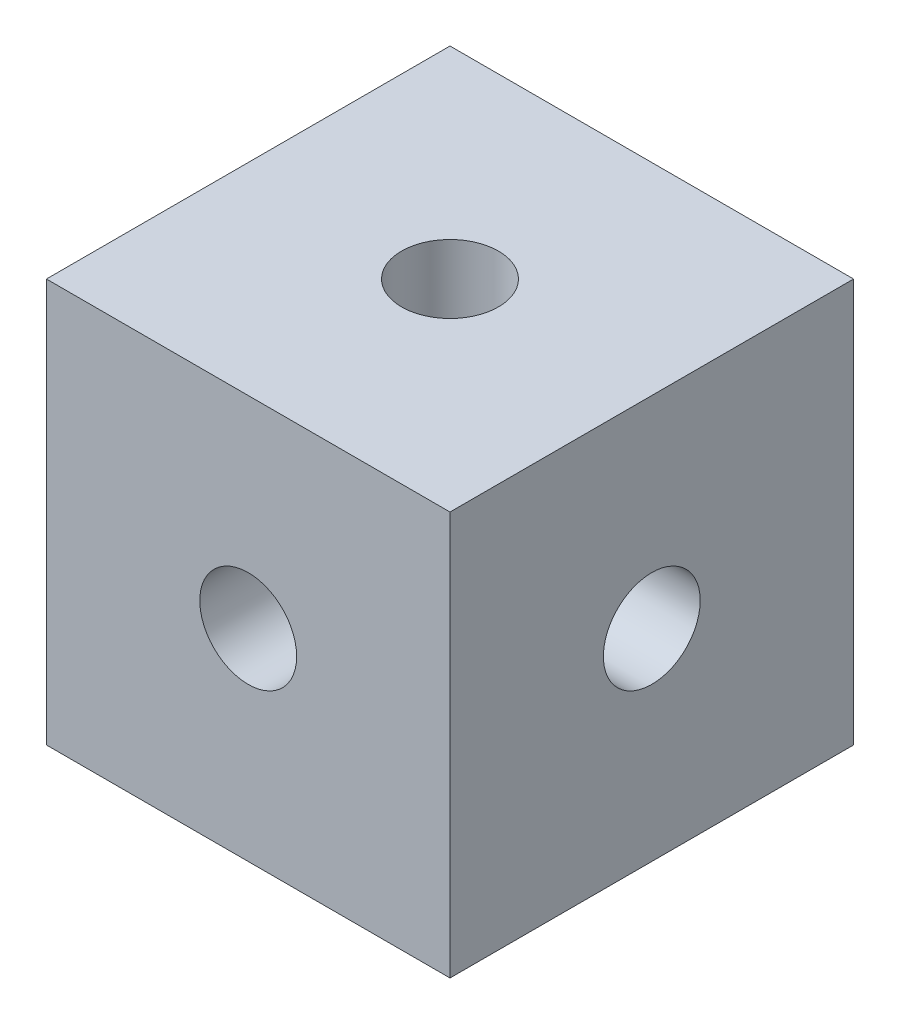
ISO-10303-21;
HEADER;
FILE_DESCRIPTION(('STEP AP214'),'2;1');
FILE_NAME('part.step','',(''),(''),'','','');
FILE_SCHEMA(('AUTOMOTIVE_DESIGN { 1 0 10303 214 1 1 1 1 }'));
ENDSEC;
DATA;
#1=APPLICATION_CONTEXT('core data for automotive mechanical design processes');
#2=APPLICATION_PROTOCOL_DEFINITION('international standard','automotive_design',2000,#1);
#3=PRODUCT_CONTEXT('',#1,'mechanical');
#4=PRODUCT('Part','Part','',(#3));
#5=PRODUCT_RELATED_PRODUCT_CATEGORY('part','',(#4));
#6=PRODUCT_DEFINITION_FORMATION('','',#4);
#7=PRODUCT_DEFINITION_CONTEXT('part definition',#1,'design');
#8=PRODUCT_DEFINITION('design','',#6,#7);
#9=PRODUCT_DEFINITION_SHAPE('','',#8);
#10=(LENGTH_UNIT() NAMED_UNIT(*) SI_UNIT(.MILLI.,.METRE.));
#11=(NAMED_UNIT(*) PLANE_ANGLE_UNIT() SI_UNIT($,.RADIAN.));
#12=(NAMED_UNIT(*) SI_UNIT($,.STERADIAN.) SOLID_ANGLE_UNIT());
#13=UNCERTAINTY_MEASURE_WITH_UNIT(LENGTH_MEASURE(1.E-05),#10,'distance_accuracy_value','');
#14=(GEOMETRIC_REPRESENTATION_CONTEXT(3) GLOBAL_UNCERTAINTY_ASSIGNED_CONTEXT((#13)) GLOBAL_UNIT_ASSIGNED_CONTEXT((#10,
#11,#12)) REPRESENTATION_CONTEXT('',''));
#15=CARTESIAN_POINT('',(0.,0.,0.));
#16=DIRECTION('',(0.,0.,1.));
#17=DIRECTION('',(1.,0.,0.));
#18=AXIS2_PLACEMENT_3D('',#15,#16,#17);
#19=CARTESIAN_POINT('',(5.,5.,10.));
#20=DIRECTION('',(0.,0.,-1.));
#21=DIRECTION('',(-1.,0.,0.));
#22=AXIS2_PLACEMENT_3D('',#19,#20,#21);
#23=CYLINDRICAL_SURFACE('',#22,1.2);
#24=CARTESIAN_POINT('',(5.,5.,5.));
#25=DIRECTION('',(0.707106781186547,0.,-0.707106781186547));
#26=DIRECTION('',(-0.707106781186547,0.,-0.707106781186547));
#27=AXIS2_PLACEMENT_3D('',#24,#25,#26);
#28=ELLIPSE('',#27,1.69705627484771,1.2);
#29=CARTESIAN_POINT('',(5.84852813742386,4.15147186257614,5.84852813742386));
#30=VERTEX_POINT('',#29);
#31=CARTESIAN_POINT('',(5.84852813742386,5.84852813742386,5.84852813742386));
#32=VERTEX_POINT('',#31);
#33=EDGE_CURVE('E60',#30,#32,#28,.F.);
#34=ORIENTED_EDGE('',*,*,#33,.F.);
#35=CARTESIAN_POINT('',(5.,5.,5.));
#36=DIRECTION('',(0.,-0.707106781186547,-0.707106781186548));
#37=DIRECTION('',(0.,0.707106781186547,-0.707106781186548));
#38=AXIS2_PLACEMENT_3D('',#35,#36,#37);
#39=ELLIPSE('',#38,1.69705627484771,1.2);
#40=CARTESIAN_POINT('',(4.15147186257614,4.15147186257614,5.84852813742386));
#41=VERTEX_POINT('',#40);
#42=EDGE_CURVE('E120',#41,#30,#39,.F.);
#43=ORIENTED_EDGE('',*,*,#42,.F.);
#44=CARTESIAN_POINT('',(5.,5.,5.));
#45=DIRECTION('',(-0.707106781186547,0.,-0.707106781186547));
#46=DIRECTION('',(0.707106781186547,0.,-0.707106781186547));
#47=AXIS2_PLACEMENT_3D('',#44,#45,#46);
#48=ELLIPSE('',#47,1.69705627484771,1.2);
#49=CARTESIAN_POINT('',(4.15147186257614,5.84852813742386,5.84852813742386));
#50=VERTEX_POINT('',#49);
#51=EDGE_CURVE('E132',#50,#41,#48,.F.);
#52=ORIENTED_EDGE('',*,*,#51,.F.);
#53=CARTESIAN_POINT('',(5.,5.,5.));
#54=DIRECTION('',(0.,0.707106781186547,-0.707106781186548));
#55=DIRECTION('',(0.,-0.707106781186547,-0.707106781186548));
#56=AXIS2_PLACEMENT_3D('',#53,#54,#55);
#57=ELLIPSE('',#56,1.69705627484771,1.2);
#58=EDGE_CURVE('E107',#32,#50,#57,.F.);
#59=ORIENTED_EDGE('',*,*,#58,.F.);
#60=EDGE_LOOP('',(#34,#43,#52,#59));
#61=FACE_BOUND('',#60,.T.);
#62=CARTESIAN_POINT('',(5.,5.,10.));
#63=DIRECTION('',(0.,0.,1.));
#64=DIRECTION('',(1.,0.,0.));
#65=AXIS2_PLACEMENT_3D('',#62,#63,#64);
#66=CIRCLE('',#65,1.2);
#67=CARTESIAN_POINT('',(6.2,5.,10.));
#68=VERTEX_POINT('',#67);
#69=EDGE_CURVE('E148',#68,#68,#66,.T.);
#70=ORIENTED_EDGE('',*,*,#69,.T.);
#71=EDGE_LOOP('',(#70));
#72=FACE_BOUND('',#71,.T.);
#73=ADVANCED_FACE('F38',(#61,#72),#23,.F.);
#74=CARTESIAN_POINT('',(0.,0.,10.));
#75=DIRECTION('',(0.,0.,1.));
#76=DIRECTION('',(1.,0.,0.));
#77=AXIS2_PLACEMENT_3D('',#74,#75,#76);
#78=PLANE('',#77);
#79=DIRECTION('',(0.,-1.,0.));
#80=VECTOR('',#79,1.);
#81=CARTESIAN_POINT('',(0.,10.,10.));
#82=LINE('',#81,#80);
#83=CARTESIAN_POINT('',(0.,10.,10.));
#84=VERTEX_POINT('',#83);
#85=CARTESIAN_POINT('',(0.,0.,10.));
#86=VERTEX_POINT('',#85);
#87=EDGE_CURVE('E154',#84,#86,#82,.T.);
#88=ORIENTED_EDGE('',*,*,#87,.T.);
#89=DIRECTION('',(1.,0.,0.));
#90=VECTOR('',#89,1.);
#91=CARTESIAN_POINT('',(0.,0.,10.));
#92=LINE('',#91,#90);
#93=CARTESIAN_POINT('',(10.,0.,10.));
#94=VERTEX_POINT('',#93);
#95=EDGE_CURVE('E157',#86,#94,#92,.T.);
#96=ORIENTED_EDGE('',*,*,#95,.T.);
#97=DIRECTION('',(0.,1.,0.));
#98=VECTOR('',#97,1.);
#99=CARTESIAN_POINT('',(10.,0.,10.));
#100=LINE('',#99,#98);
#101=CARTESIAN_POINT('',(10.,10.,10.));
#102=VERTEX_POINT('',#101);
#103=EDGE_CURVE('E160',#94,#102,#100,.T.);
#104=ORIENTED_EDGE('',*,*,#103,.T.);
#105=DIRECTION('',(-1.,0.,0.));
#106=VECTOR('',#105,1.);
#107=CARTESIAN_POINT('',(10.,10.,10.));
#108=LINE('',#107,#106);
#109=EDGE_CURVE('E162',#102,#84,#108,.T.);
#110=ORIENTED_EDGE('',*,*,#109,.T.);
#111=EDGE_LOOP('',(#88,#96,#104,#110));
#112=FACE_BOUND('',#111,.T.);
#113=ORIENTED_EDGE('',*,*,#69,.F.);
#114=EDGE_LOOP('',(#113));
#115=FACE_BOUND('',#114,.T.);
#116=ADVANCED_FACE('F201',(#112,#115),#78,.T.);
#117=CARTESIAN_POINT('',(0.,0.,0.));
#118=DIRECTION('',(0.,0.,1.));
#119=DIRECTION('',(1.,0.,0.));
#120=AXIS2_PLACEMENT_3D('',#117,#118,#119);
#121=PLANE('',#120);
#122=DIRECTION('',(0.,-1.,0.));
#123=VECTOR('',#122,1.);
#124=CARTESIAN_POINT('',(0.,10.,0.));
#125=LINE('',#124,#123);
#126=CARTESIAN_POINT('',(0.,10.,0.));
#127=VERTEX_POINT('',#126);
#128=CARTESIAN_POINT('',(0.,0.,0.));
#129=VERTEX_POINT('',#128);
#130=EDGE_CURVE('E151',#127,#129,#125,.T.);
#131=ORIENTED_EDGE('',*,*,#130,.F.);
#132=DIRECTION('',(-1.,0.,0.));
#133=VECTOR('',#132,1.);
#134=CARTESIAN_POINT('',(10.,10.,0.));
#135=LINE('',#134,#133);
#136=CARTESIAN_POINT('',(10.,10.,0.));
#137=VERTEX_POINT('',#136);
#138=EDGE_CURVE('E158',#137,#127,#135,.T.);
#139=ORIENTED_EDGE('',*,*,#138,.F.);
#140=DIRECTION('',(0.,1.,0.));
#141=VECTOR('',#140,1.);
#142=CARTESIAN_POINT('',(10.,0.,0.));
#143=LINE('',#142,#141);
#144=CARTESIAN_POINT('',(10.,0.,0.));
#145=VERTEX_POINT('',#144);
#146=EDGE_CURVE('E169',#145,#137,#143,.T.);
#147=ORIENTED_EDGE('',*,*,#146,.F.);
#148=DIRECTION('',(1.,0.,0.));
#149=VECTOR('',#148,1.);
#150=CARTESIAN_POINT('',(0.,0.,0.));
#151=LINE('',#150,#149);
#152=EDGE_CURVE('E167',#129,#145,#151,.T.);
#153=ORIENTED_EDGE('',*,*,#152,.F.);
#154=EDGE_LOOP('',(#131,#139,#147,#153));
#155=FACE_BOUND('',#154,.T.);
#156=CARTESIAN_POINT('',(5.,5.,0.));
#157=DIRECTION('',(0.,0.,1.));
#158=DIRECTION('',(1.,0.,0.));
#159=AXIS2_PLACEMENT_3D('',#156,#157,#158);
#160=CIRCLE('',#159,1.2);
#161=CARTESIAN_POINT('',(6.2,5.,0.));
#162=VERTEX_POINT('',#161);
#163=EDGE_CURVE('E145',#162,#162,#160,.T.);
#164=ORIENTED_EDGE('',*,*,#163,.T.);
#165=EDGE_LOOP('',(#164));
#166=FACE_BOUND('',#165,.T.);
#167=ADVANCED_FACE('F190',(#155,#166),#121,.F.);
#168=CARTESIAN_POINT('',(0.,10.,10.));
#169=DIRECTION('',(1.,0.,0.));
#170=DIRECTION('',(0.,1.,0.));
#171=AXIS2_PLACEMENT_3D('',#168,#169,#170);
#172=PLANE('',#171);
#173=CARTESIAN_POINT('',(0.,5.,5.));
#174=DIRECTION('',(1.,0.,0.));
#175=DIRECTION('',(0.,0.,-1.));
#176=AXIS2_PLACEMENT_3D('',#173,#174,#175);
#177=CIRCLE('',#176,1.2);
#178=CARTESIAN_POINT('',(0.,5.,3.8));
#179=VERTEX_POINT('',#178);
#180=EDGE_CURVE('E116',#179,#179,#177,.T.);
#181=ORIENTED_EDGE('',*,*,#180,.T.);
#182=EDGE_LOOP('',(#181));
#183=FACE_BOUND('',#182,.T.);
#184=ORIENTED_EDGE('',*,*,#130,.T.);
#185=DIRECTION('',(0.,0.,-1.));
#186=VECTOR('',#185,1.);
#187=CARTESIAN_POINT('',(0.,0.,10.));
#188=LINE('',#187,#186);
#189=EDGE_CURVE('E124',#86,#129,#188,.T.);
#190=ORIENTED_EDGE('',*,*,#189,.F.);
#191=ORIENTED_EDGE('',*,*,#87,.F.);
#192=DIRECTION('',(0.,0.,-1.));
#193=VECTOR('',#192,1.);
#194=CARTESIAN_POINT('',(0.,10.,10.));
#195=LINE('',#194,#193);
#196=EDGE_CURVE('E164',#84,#127,#195,.T.);
#197=ORIENTED_EDGE('',*,*,#196,.T.);
#198=EDGE_LOOP('',(#184,#190,#191,#197));
#199=FACE_BOUND('',#198,.T.);
#200=ADVANCED_FACE('F40',(#183,#199),#172,.F.);
#201=CARTESIAN_POINT('',(0.,0.,10.));
#202=DIRECTION('',(0.,1.,0.));
#203=DIRECTION('',(0.,0.,1.));
#204=AXIS2_PLACEMENT_3D('',#201,#202,#203);
#205=PLANE('',#204);
#206=CARTESIAN_POINT('',(5.,0.,5.));
#207=DIRECTION('',(0.,1.,0.));
#208=DIRECTION('',(-1.,0.,0.));
#209=AXIS2_PLACEMENT_3D('',#206,#207,#208);
#210=CIRCLE('',#209,1.2);
#211=CARTESIAN_POINT('',(3.8,0.,5.));
#212=VERTEX_POINT('',#211);
#213=EDGE_CURVE('E142',#212,#212,#210,.T.);
#214=ORIENTED_EDGE('',*,*,#213,.T.);
#215=EDGE_LOOP('',(#214));
#216=FACE_BOUND('',#215,.T.);
#217=ORIENTED_EDGE('',*,*,#152,.T.);
#218=DIRECTION('',(0.,0.,-1.));
#219=VECTOR('',#218,1.);
#220=CARTESIAN_POINT('',(10.,0.,10.));
#221=LINE('',#220,#219);
#222=EDGE_CURVE('E177',#94,#145,#221,.T.);
#223=ORIENTED_EDGE('',*,*,#222,.F.);
#224=ORIENTED_EDGE('',*,*,#95,.F.);
#225=ORIENTED_EDGE('',*,*,#189,.T.);
#226=EDGE_LOOP('',(#217,#223,#224,#225));
#227=FACE_BOUND('',#226,.T.);
#228=ADVANCED_FACE('F182',(#216,#227),#205,.F.);
#229=CARTESIAN_POINT('',(10.,0.,10.));
#230=DIRECTION('',(-1.,0.,0.));
#231=DIRECTION('',(0.,0.,1.));
#232=AXIS2_PLACEMENT_3D('',#229,#230,#231);
#233=PLANE('',#232);
#234=CARTESIAN_POINT('',(10.,5.,5.));
#235=DIRECTION('',(1.,0.,0.));
#236=DIRECTION('',(0.,0.,-1.));
#237=AXIS2_PLACEMENT_3D('',#234,#235,#236);
#238=CIRCLE('',#237,1.2);
#239=CARTESIAN_POINT('',(10.,5.,3.8));
#240=VERTEX_POINT('',#239);
#241=EDGE_CURVE('E241',#240,#240,#238,.T.);
#242=ORIENTED_EDGE('',*,*,#241,.F.);
#243=EDGE_LOOP('',(#242));
#244=FACE_BOUND('',#243,.T.);
#245=ORIENTED_EDGE('',*,*,#146,.T.);
#246=DIRECTION('',(0.,0.,-1.));
#247=VECTOR('',#246,1.);
#248=CARTESIAN_POINT('',(10.,10.,10.));
#249=LINE('',#248,#247);
#250=EDGE_CURVE('E174',#102,#137,#249,.T.);
#251=ORIENTED_EDGE('',*,*,#250,.F.);
#252=ORIENTED_EDGE('',*,*,#103,.F.);
#253=ORIENTED_EDGE('',*,*,#222,.T.);
#254=EDGE_LOOP('',(#245,#251,#252,#253));
#255=FACE_BOUND('',#254,.T.);
#256=ADVANCED_FACE('F195',(#244,#255),#233,.F.);
#257=CARTESIAN_POINT('',(10.,10.,10.));
#258=DIRECTION('',(0.,-1.,0.));
#259=DIRECTION('',(1.,0.,0.));
#260=AXIS2_PLACEMENT_3D('',#257,#258,#259);
#261=PLANE('',#260);
#262=CARTESIAN_POINT('',(5.,10.,5.));
#263=DIRECTION('',(0.,1.,0.));
#264=DIRECTION('',(-1.,0.,0.));
#265=AXIS2_PLACEMENT_3D('',#262,#263,#264);
#266=CIRCLE('',#265,1.2);
#267=CARTESIAN_POINT('',(3.8,10.,5.));
#268=VERTEX_POINT('',#267);
#269=EDGE_CURVE('E136',#268,#268,#266,.T.);
#270=ORIENTED_EDGE('',*,*,#269,.F.);
#271=EDGE_LOOP('',(#270));
#272=FACE_BOUND('',#271,.T.);
#273=ORIENTED_EDGE('',*,*,#138,.T.);
#274=ORIENTED_EDGE('',*,*,#196,.F.);
#275=ORIENTED_EDGE('',*,*,#109,.F.);
#276=ORIENTED_EDGE('',*,*,#250,.T.);
#277=EDGE_LOOP('',(#273,#274,#275,#276));
#278=FACE_BOUND('',#277,.T.);
#279=ADVANCED_FACE('F199',(#272,#278),#261,.F.);
#280=CARTESIAN_POINT('',(5.,5.,5.));
#281=DIRECTION('',(0.707106781186547,0.,-0.707106781186547));
#282=DIRECTION('',(-0.707106781186547,0.,-0.707106781186547));
#283=AXIS2_PLACEMENT_3D('',#280,#281,#282);
#284=ELLIPSE('',#283,1.69705627484771,1.2);
#285=CARTESIAN_POINT('',(4.15147186257614,4.15147186257614,4.15147186257614));
#286=VERTEX_POINT('',#285);
#287=CARTESIAN_POINT('',(4.15147186257615,5.84852813742386,4.15147186257614));
#288=VERTEX_POINT('',#287);
#289=EDGE_CURVE('E53',#286,#288,#284,.T.);
#290=ORIENTED_EDGE('',*,*,#289,.F.);
#291=CARTESIAN_POINT('',(5.,5.,5.));
#292=DIRECTION('',(0.,0.707106781186547,-0.707106781186548));
#293=DIRECTION('',(0.,-0.707106781186547,-0.707106781186548));
#294=AXIS2_PLACEMENT_3D('',#291,#292,#293);
#295=ELLIPSE('',#294,1.69705627484771,1.2);
#296=CARTESIAN_POINT('',(5.84852813742386,4.15147186257614,4.15147186257614));
#297=VERTEX_POINT('',#296);
#298=EDGE_CURVE('E115',#297,#286,#295,.T.);
#299=ORIENTED_EDGE('',*,*,#298,.F.);
#300=CARTESIAN_POINT('',(5.,5.,5.));
#301=DIRECTION('',(-0.707106781186547,0.,-0.707106781186547));
#302=DIRECTION('',(0.707106781186547,0.,-0.707106781186547));
#303=AXIS2_PLACEMENT_3D('',#300,#301,#302);
#304=ELLIPSE('',#303,1.69705627484771,1.2);
#305=CARTESIAN_POINT('',(5.84852813742386,5.84852813742386,4.15147186257614));
#306=VERTEX_POINT('',#305);
#307=EDGE_CURVE('E101',#306,#297,#304,.T.);
#308=ORIENTED_EDGE('',*,*,#307,.F.);
#309=CARTESIAN_POINT('',(5.,5.,5.));
#310=DIRECTION('',(0.,-0.707106781186547,-0.707106781186548));
#311=DIRECTION('',(0.,0.707106781186547,-0.707106781186548));
#312=AXIS2_PLACEMENT_3D('',#309,#310,#311);
#313=ELLIPSE('',#312,1.69705627484771,1.2);
#314=EDGE_CURVE('E113',#288,#306,#313,.T.);
#315=ORIENTED_EDGE('',*,*,#314,.F.);
#316=EDGE_LOOP('',(#290,#299,#308,#315));
#317=FACE_BOUND('',#316,.T.);
#318=ORIENTED_EDGE('',*,*,#163,.F.);
#319=EDGE_LOOP('',(#318));
#320=FACE_BOUND('',#319,.T.);
#321=ADVANCED_FACE('F111',(#317,#320),#23,.F.);
#322=CARTESIAN_POINT('',(5.,0.,5.));
#323=DIRECTION('',(0.,1.,0.));
#324=DIRECTION('',(-1.,0.,0.));
#325=AXIS2_PLACEMENT_3D('',#322,#323,#324);
#326=CYLINDRICAL_SURFACE('',#325,1.2);
#327=ORIENTED_EDGE('',*,*,#42,.T.);
#328=CARTESIAN_POINT('',(5.,5.,5.));
#329=DIRECTION('',(0.707106781186547,0.707106781186548,0.));
#330=DIRECTION('',(-0.707106781186548,0.707106781186547,0.));
#331=AXIS2_PLACEMENT_3D('',#328,#329,#330);
#332=ELLIPSE('',#331,1.69705627484771,1.2);
#333=EDGE_CURVE('E138',#30,#297,#332,.T.);
#334=ORIENTED_EDGE('',*,*,#333,.T.);
#335=ORIENTED_EDGE('',*,*,#298,.T.);
#336=CARTESIAN_POINT('',(5.,5.,5.));
#337=DIRECTION('',(-0.707106781186548,0.707106781186547,0.));
#338=DIRECTION('',(0.707106781186547,0.707106781186548,0.));
#339=AXIS2_PLACEMENT_3D('',#336,#337,#338);
#340=ELLIPSE('',#339,1.69705627484771,1.2);
#341=EDGE_CURVE('E134',#286,#41,#340,.T.);
#342=ORIENTED_EDGE('',*,*,#341,.T.);
#343=EDGE_LOOP('',(#327,#334,#335,#342));
#344=FACE_BOUND('',#343,.T.);
#345=ORIENTED_EDGE('',*,*,#213,.F.);
#346=EDGE_LOOP('',(#345));
#347=FACE_BOUND('',#346,.T.);
#348=ADVANCED_FACE('F212',(#344,#347),#326,.F.);
#349=ORIENTED_EDGE('',*,*,#58,.T.);
#350=CARTESIAN_POINT('',(5.,5.,5.));
#351=DIRECTION('',(0.707106781186547,0.707106781186548,0.));
#352=DIRECTION('',(-0.707106781186548,0.707106781186547,0.));
#353=AXIS2_PLACEMENT_3D('',#350,#351,#352);
#354=ELLIPSE('',#353,1.69705627484771,1.2);
#355=EDGE_CURVE('E11',#50,#288,#354,.F.);
#356=ORIENTED_EDGE('',*,*,#355,.T.);
#357=ORIENTED_EDGE('',*,*,#314,.T.);
#358=CARTESIAN_POINT('',(5.,5.,5.));
#359=DIRECTION('',(-0.707106781186548,0.707106781186547,0.));
#360=DIRECTION('',(0.707106781186547,0.707106781186548,0.));
#361=AXIS2_PLACEMENT_3D('',#358,#359,#360);
#362=ELLIPSE('',#361,1.69705627484771,1.2);
#363=EDGE_CURVE('E46',#306,#32,#362,.F.);
#364=ORIENTED_EDGE('',*,*,#363,.T.);
#365=EDGE_LOOP('',(#349,#356,#357,#364));
#366=FACE_BOUND('',#365,.T.);
#367=ORIENTED_EDGE('',*,*,#269,.T.);
#368=EDGE_LOOP('',(#367));
#369=FACE_BOUND('',#368,.T.);
#370=ADVANCED_FACE('F118',(#366,#369),#326,.F.);
#371=CARTESIAN_POINT('',(0.,5.,5.));
#372=DIRECTION('',(1.,0.,0.));
#373=DIRECTION('',(0.,0.,-1.));
#374=AXIS2_PLACEMENT_3D('',#371,#372,#373);
#375=CYLINDRICAL_SURFACE('',#374,1.2);
#376=ORIENTED_EDGE('',*,*,#241,.T.);
#377=EDGE_LOOP('',(#376));
#378=FACE_BOUND('',#377,.T.);
#379=ORIENTED_EDGE('',*,*,#33,.T.);
#380=ORIENTED_EDGE('',*,*,#363,.F.);
#381=ORIENTED_EDGE('',*,*,#307,.T.);
#382=ORIENTED_EDGE('',*,*,#333,.F.);
#383=EDGE_LOOP('',(#379,#380,#381,#382));
#384=FACE_BOUND('',#383,.T.);
#385=ADVANCED_FACE('F100',(#378,#384),#375,.F.);
#386=ORIENTED_EDGE('',*,*,#180,.F.);
#387=EDGE_LOOP('',(#386));
#388=FACE_BOUND('',#387,.T.);
#389=ORIENTED_EDGE('',*,*,#289,.T.);
#390=ORIENTED_EDGE('',*,*,#355,.F.);
#391=ORIENTED_EDGE('',*,*,#51,.T.);
#392=ORIENTED_EDGE('',*,*,#341,.F.);
#393=EDGE_LOOP('',(#389,#390,#391,#392));
#394=FACE_BOUND('',#393,.T.);
#395=ADVANCED_FACE('F246',(#388,#394),#375,.F.);
#396=CLOSED_SHELL('',(#73,#116,#167,#200,#228,#256,#279,#321,#348,#370,#385,#395));
#397=MANIFOLD_SOLID_BREP('B2',#396);
#398=ADVANCED_BREP_SHAPE_REPRESENTATION('',(#18,#397),#14);
#399=SHAPE_DEFINITION_REPRESENTATION(#9,#398);
ENDSEC;
END-ISO-10303-21;
